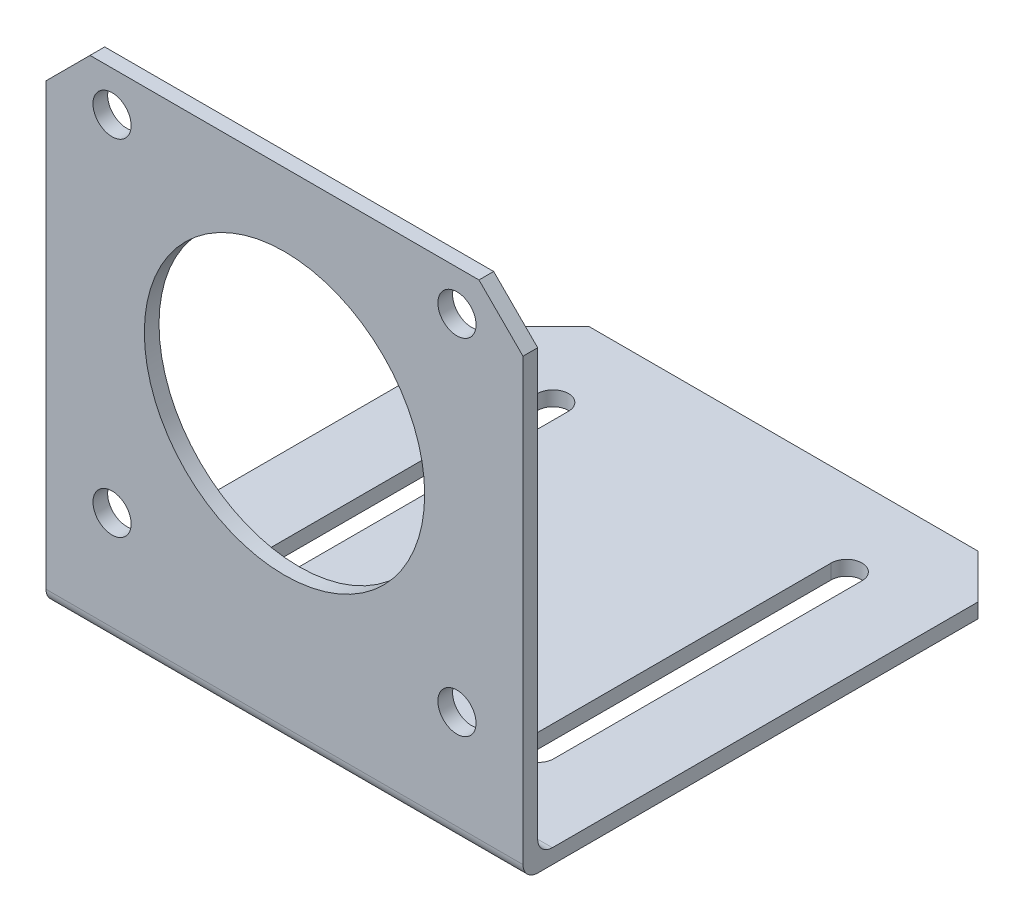
ISO-10303-21;
HEADER;
FILE_DESCRIPTION(('STEP AP214'),'2;1');
FILE_NAME('part.step','',(''),(''),'','','');
FILE_SCHEMA(('AUTOMOTIVE_DESIGN { 1 0 10303 214 1 1 1 1 }'));
ENDSEC;
DATA;
#1=APPLICATION_CONTEXT('core data for automotive mechanical design processes');
#2=APPLICATION_PROTOCOL_DEFINITION('international standard','automotive_design',2000,#1);
#3=PRODUCT_CONTEXT('',#1,'mechanical');
#4=PRODUCT('Part','Part','',(#3));
#5=PRODUCT_RELATED_PRODUCT_CATEGORY('part','',(#4));
#6=PRODUCT_DEFINITION_FORMATION('','',#4);
#7=PRODUCT_DEFINITION_CONTEXT('part definition',#1,'design');
#8=PRODUCT_DEFINITION('design','',#6,#7);
#9=PRODUCT_DEFINITION_SHAPE('','',#8);
#10=(LENGTH_UNIT() NAMED_UNIT(*) SI_UNIT(.MILLI.,.METRE.));
#11=(NAMED_UNIT(*) PLANE_ANGLE_UNIT() SI_UNIT($,.RADIAN.));
#12=(NAMED_UNIT(*) SI_UNIT($,.STERADIAN.) SOLID_ANGLE_UNIT());
#13=UNCERTAINTY_MEASURE_WITH_UNIT(LENGTH_MEASURE(1.E-05),#10,'distance_accuracy_value','');
#14=(GEOMETRIC_REPRESENTATION_CONTEXT(3) GLOBAL_UNCERTAINTY_ASSIGNED_CONTEXT((#13)) GLOBAL_UNIT_ASSIGNED_CONTEXT((#10,
#11,#12)) REPRESENTATION_CONTEXT('',''));
#15=CARTESIAN_POINT('',(0.,0.,0.));
#16=DIRECTION('',(0.,0.,1.));
#17=DIRECTION('',(1.,0.,0.));
#18=AXIS2_PLACEMENT_3D('',#15,#16,#17);
#19=CARTESIAN_POINT('',(-28.953125,-17.4203125,2.));
#20=DIRECTION('',(0.,1.,0.));
#21=DIRECTION('',(0.,0.,1.));
#22=AXIS2_PLACEMENT_3D('',#19,#20,#21);
#23=PLANE('',#22);
#24=DIRECTION('',(0.,0.,-1.));
#25=VECTOR('',#24,1.);
#26=CARTESIAN_POINT('',(36.046875,-17.4203125,2.));
#27=LINE('',#26,#25);
#28=CARTESIAN_POINT('',(36.046875,-17.4203125,0.));
#29=VERTEX_POINT('',#28);
#30=CARTESIAN_POINT('',(36.046875,-17.4203125,-60.));
#31=VERTEX_POINT('',#30);
#32=EDGE_CURVE('E262',#29,#31,#27,.T.);
#33=ORIENTED_EDGE('',*,*,#32,.F.);
#34=DIRECTION('',(1.,0.,0.));
#35=VECTOR('',#34,1.);
#36=CARTESIAN_POINT('',(-28.953125,-17.4203125,0.));
#37=LINE('',#36,#35);
#38=CARTESIAN_POINT('',(-28.953125,-17.4203125,0.));
#39=VERTEX_POINT('',#38);
#40=EDGE_CURVE('E319',#29,#39,#37,.F.);
#41=ORIENTED_EDGE('',*,*,#40,.T.);
#42=DIRECTION('',(0.,0.,-1.));
#43=VECTOR('',#42,1.);
#44=CARTESIAN_POINT('',(-28.953125,-17.4203125,2.));
#45=LINE('',#44,#43);
#46=CARTESIAN_POINT('',(-28.953125,-17.4203125,-60.));
#47=VERTEX_POINT('',#46);
#48=EDGE_CURVE('E268',#39,#47,#45,.T.);
#49=ORIENTED_EDGE('',*,*,#48,.T.);
#50=DIRECTION('',(0.707106781186547,0.,-0.707106781186548));
#51=VECTOR('',#50,1.);
#52=CARTESIAN_POINT('',(-22.953125,-17.4203125,-66.));
#53=LINE('',#52,#51);
#54=CARTESIAN_POINT('',(-22.953125,-17.4203125,-66.));
#55=VERTEX_POINT('',#54);
#56=EDGE_CURVE('E290',#47,#55,#53,.T.);
#57=ORIENTED_EDGE('',*,*,#56,.T.);
#58=DIRECTION('',(1.,0.,0.));
#59=VECTOR('',#58,1.);
#60=CARTESIAN_POINT('',(-28.953125,-17.4203125,-66.));
#61=LINE('',#60,#59);
#62=CARTESIAN_POINT('',(30.046875,-17.4203125,-66.));
#63=VERTEX_POINT('',#62);
#64=EDGE_CURVE('E244',#55,#63,#61,.T.);
#65=ORIENTED_EDGE('',*,*,#64,.T.);
#66=DIRECTION('',(0.70710678118655,0.,0.707106781186545));
#67=VECTOR('',#66,1.);
#68=CARTESIAN_POINT('',(36.046875,-17.4203125,-60.));
#69=LINE('',#68,#67);
#70=EDGE_CURVE('E279',#63,#31,#69,.T.);
#71=ORIENTED_EDGE('',*,*,#70,.T.);
#72=EDGE_LOOP('',(#33,#41,#49,#57,#65,#71));
#73=FACE_BOUND('',#72,.T.);
#74=DIRECTION('',(0.,0.,-1.));
#75=VECTOR('',#74,1.);
#76=CARTESIAN_POINT('',(21.446875,-17.4203125,-12.5946516396418));
#77=LINE('',#76,#75);
#78=CARTESIAN_POINT('',(21.446875,-17.4203125,-12.5946516396418));
#79=VERTEX_POINT('',#78);
#80=CARTESIAN_POINT('',(21.446875,-17.4203125,-54.5946516396418));
#81=VERTEX_POINT('',#80);
#82=EDGE_CURVE('E218',#79,#81,#77,.T.);
#83=ORIENTED_EDGE('',*,*,#82,.F.);
#84=CARTESIAN_POINT('',(23.546875,-17.4203125,-12.5946516396418));
#85=DIRECTION('',(0.,1.,0.));
#86=DIRECTION('',(-1.,0.,0.));
#87=AXIS2_PLACEMENT_3D('',#84,#85,#86);
#88=CIRCLE('',#87,2.1);
#89=CARTESIAN_POINT('',(25.646875,-17.4203125,-12.5946516396418));
#90=VERTEX_POINT('',#89);
#91=EDGE_CURVE('E208',#79,#90,#88,.T.);
#92=ORIENTED_EDGE('',*,*,#91,.T.);
#93=DIRECTION('',(0.,0.,-1.));
#94=VECTOR('',#93,1.);
#95=CARTESIAN_POINT('',(25.646875,-17.4203125,-12.5946516396418));
#96=LINE('',#95,#94);
#97=CARTESIAN_POINT('',(25.646875,-17.4203125,-54.5946516396418));
#98=VERTEX_POINT('',#97);
#99=EDGE_CURVE('E211',#90,#98,#96,.T.);
#100=ORIENTED_EDGE('',*,*,#99,.T.);
#101=CARTESIAN_POINT('',(23.546875,-17.4203125,-54.5946516396418));
#102=DIRECTION('',(0.,1.,0.));
#103=DIRECTION('',(-1.,0.,0.));
#104=AXIS2_PLACEMENT_3D('',#101,#102,#103);
#105=CIRCLE('',#104,2.09999999999999);
#106=EDGE_CURVE('E215',#98,#81,#105,.T.);
#107=ORIENTED_EDGE('',*,*,#106,.T.);
#108=EDGE_LOOP('',(#83,#92,#100,#107));
#109=FACE_BOUND('',#108,.T.);
#110=CARTESIAN_POINT('',(-16.453125,-17.4203125,-12.5946516396418));
#111=DIRECTION('',(0.,-1.,0.));
#112=DIRECTION('',(1.,0.,0.));
#113=AXIS2_PLACEMENT_3D('',#110,#111,#112);
#114=CIRCLE('',#113,2.1);
#115=CARTESIAN_POINT('',(-14.353125,-17.4203125,-12.5946516396418));
#116=VERTEX_POINT('',#115);
#117=CARTESIAN_POINT('',(-18.553125,-17.4203125,-12.5946516396418));
#118=VERTEX_POINT('',#117);
#119=EDGE_CURVE('E191',#116,#118,#114,.T.);
#120=ORIENTED_EDGE('',*,*,#119,.F.);
#121=DIRECTION('',(0.,0.,-1.));
#122=VECTOR('',#121,1.);
#123=CARTESIAN_POINT('',(-14.353125,-17.4203125,-12.5946516396418));
#124=LINE('',#123,#122);
#125=CARTESIAN_POINT('',(-14.353125,-17.4203125,-54.5946516396418));
#126=VERTEX_POINT('',#125);
#127=EDGE_CURVE('E202',#116,#126,#124,.T.);
#128=ORIENTED_EDGE('',*,*,#127,.T.);
#129=CARTESIAN_POINT('',(-16.453125,-17.4203125,-54.5946516396418));
#130=DIRECTION('',(0.,-1.,0.));
#131=DIRECTION('',(1.,0.,0.));
#132=AXIS2_PLACEMENT_3D('',#129,#130,#131);
#133=CIRCLE('',#132,2.09999999999999);
#134=CARTESIAN_POINT('',(-18.553125,-17.4203125,-54.5946516396418));
#135=VERTEX_POINT('',#134);
#136=EDGE_CURVE('E178',#135,#126,#133,.T.);
#137=ORIENTED_EDGE('',*,*,#136,.F.);
#138=DIRECTION('',(0.,0.,-1.));
#139=VECTOR('',#138,1.);
#140=CARTESIAN_POINT('',(-18.553125,-17.4203125,-12.5946516396418));
#141=LINE('',#140,#139);
#142=EDGE_CURVE('E205',#118,#135,#141,.T.);
#143=ORIENTED_EDGE('',*,*,#142,.F.);
#144=EDGE_LOOP('',(#120,#128,#137,#143));
#145=FACE_BOUND('',#144,.T.);
#146=ADVANCED_FACE('F34',(#73,#109,#145),#23,.F.);
#147=CARTESIAN_POINT('',(-28.953125,-15.4203125,0.));
#148=DIRECTION('',(0.,1.,0.));
#149=DIRECTION('',(-1.,0.,0.));
#150=AXIS2_PLACEMENT_3D('',#147,#148,#149);
#151=PLANE('',#150);
#152=CARTESIAN_POINT('',(23.546875,-15.4203125,-12.5946516396418));
#153=DIRECTION('',(0.,1.,0.));
#154=DIRECTION('',(-1.,0.,0.));
#155=AXIS2_PLACEMENT_3D('',#152,#153,#154);
#156=CIRCLE('',#155,2.1);
#157=CARTESIAN_POINT('',(21.446875,-15.4203125,-12.5946516396418));
#158=VERTEX_POINT('',#157);
#159=CARTESIAN_POINT('',(25.646875,-15.4203125,-12.5946516396418));
#160=VERTEX_POINT('',#159);
#161=EDGE_CURVE('E201',#158,#160,#156,.T.);
#162=ORIENTED_EDGE('',*,*,#161,.F.);
#163=DIRECTION('',(0.,0.,-1.));
#164=VECTOR('',#163,1.);
#165=CARTESIAN_POINT('',(21.446875,-15.4203125,-12.5946516396418));
#166=LINE('',#165,#164);
#167=CARTESIAN_POINT('',(21.446875,-15.4203125,-54.5946516396418));
#168=VERTEX_POINT('',#167);
#169=EDGE_CURVE('E212',#158,#168,#166,.T.);
#170=ORIENTED_EDGE('',*,*,#169,.T.);
#171=CARTESIAN_POINT('',(23.546875,-15.4203125,-54.5946516396418));
#172=DIRECTION('',(0.,1.,0.));
#173=DIRECTION('',(-1.,0.,0.));
#174=AXIS2_PLACEMENT_3D('',#171,#172,#173);
#175=CIRCLE('',#174,2.09999999999999);
#176=CARTESIAN_POINT('',(25.646875,-15.4203125,-54.5946516396418));
#177=VERTEX_POINT('',#176);
#178=EDGE_CURVE('E225',#177,#168,#175,.T.);
#179=ORIENTED_EDGE('',*,*,#178,.F.);
#180=DIRECTION('',(0.,0.,-1.));
#181=VECTOR('',#180,1.);
#182=CARTESIAN_POINT('',(25.646875,-15.4203125,-12.5946516396418));
#183=LINE('',#182,#181);
#184=EDGE_CURVE('E222',#160,#177,#183,.T.);
#185=ORIENTED_EDGE('',*,*,#184,.F.);
#186=EDGE_LOOP('',(#162,#170,#179,#185));
#187=FACE_BOUND('',#186,.T.);
#188=DIRECTION('',(0.,0.,1.));
#189=VECTOR('',#188,1.);
#190=CARTESIAN_POINT('',(-28.953125,-15.4203125,0.));
#191=LINE('',#190,#189);
#192=CARTESIAN_POINT('',(-28.953125,-15.4203125,-60.));
#193=VERTEX_POINT('',#192);
#194=CARTESIAN_POINT('',(-28.953125,-15.4203125,-2.));
#195=VERTEX_POINT('',#194);
#196=EDGE_CURVE('E239',#193,#195,#191,.T.);
#197=ORIENTED_EDGE('',*,*,#196,.T.);
#198=DIRECTION('',(1.,0.,0.));
#199=VECTOR('',#198,1.);
#200=CARTESIAN_POINT('',(-28.953125,-15.4203125,-2.));
#201=LINE('',#200,#199);
#202=CARTESIAN_POINT('',(36.046875,-15.4203125,-2.));
#203=VERTEX_POINT('',#202);
#204=EDGE_CURVE('E323',#195,#203,#201,.T.);
#205=ORIENTED_EDGE('',*,*,#204,.T.);
#206=DIRECTION('',(0.,0.,1.));
#207=VECTOR('',#206,1.);
#208=CARTESIAN_POINT('',(36.046875,-15.4203125,0.));
#209=LINE('',#208,#207);
#210=CARTESIAN_POINT('',(36.046875,-15.4203125,-60.));
#211=VERTEX_POINT('',#210);
#212=EDGE_CURVE('E232',#211,#203,#209,.T.);
#213=ORIENTED_EDGE('',*,*,#212,.F.);
#214=DIRECTION('',(-0.70710678118655,0.,-0.707106781186545));
#215=VECTOR('',#214,1.);
#216=CARTESIAN_POINT('',(33.5468749999998,-15.4203125,-62.5000000000002));
#217=LINE('',#216,#215);
#218=CARTESIAN_POINT('',(30.046875,-15.4203125,-66.));
#219=VERTEX_POINT('',#218);
#220=EDGE_CURVE('E273',#211,#219,#217,.T.);
#221=ORIENTED_EDGE('',*,*,#220,.T.);
#222=DIRECTION('',(1.,0.,0.));
#223=VECTOR('',#222,1.);
#224=CARTESIAN_POINT('',(-28.953125,-15.4203125,-66.));
#225=LINE('',#224,#223);
#226=CARTESIAN_POINT('',(-22.953125,-15.4203125,-66.));
#227=VERTEX_POINT('',#226);
#228=EDGE_CURVE('E242',#227,#219,#225,.T.);
#229=ORIENTED_EDGE('',*,*,#228,.F.);
#230=DIRECTION('',(-0.707106781186547,0.,0.707106781186548));
#231=VECTOR('',#230,1.);
#232=CARTESIAN_POINT('',(-58.953125,-15.4203125,-30.));
#233=LINE('',#232,#231);
#234=EDGE_CURVE('E285',#227,#193,#233,.T.);
#235=ORIENTED_EDGE('',*,*,#234,.T.);
#236=EDGE_LOOP('',(#197,#205,#213,#221,#229,#235));
#237=FACE_BOUND('',#236,.T.);
#238=DIRECTION('',(0.,0.,-1.));
#239=VECTOR('',#238,1.);
#240=CARTESIAN_POINT('',(-14.353125,-15.4203125,-12.5946516396418));
#241=LINE('',#240,#239);
#242=CARTESIAN_POINT('',(-14.353125,-15.4203125,-12.5946516396418));
#243=VERTEX_POINT('',#242);
#244=CARTESIAN_POINT('',(-14.353125,-15.4203125,-54.5946516396418));
#245=VERTEX_POINT('',#244);
#246=EDGE_CURVE('E187',#243,#245,#241,.T.);
#247=ORIENTED_EDGE('',*,*,#246,.F.);
#248=CARTESIAN_POINT('',(-16.453125,-15.4203125,-12.5946516396418));
#249=DIRECTION('',(0.,-1.,0.));
#250=DIRECTION('',(1.,0.,0.));
#251=AXIS2_PLACEMENT_3D('',#248,#249,#250);
#252=CIRCLE('',#251,2.1);
#253=CARTESIAN_POINT('',(-18.553125,-15.4203125,-12.5946516396418));
#254=VERTEX_POINT('',#253);
#255=EDGE_CURVE('E196',#243,#254,#252,.T.);
#256=ORIENTED_EDGE('',*,*,#255,.T.);
#257=DIRECTION('',(0.,0.,-1.));
#258=VECTOR('',#257,1.);
#259=CARTESIAN_POINT('',(-18.553125,-15.4203125,-12.5946516396418));
#260=LINE('',#259,#258);
#261=CARTESIAN_POINT('',(-18.553125,-15.4203125,-54.5946516396418));
#262=VERTEX_POINT('',#261);
#263=EDGE_CURVE('E194',#254,#262,#260,.T.);
#264=ORIENTED_EDGE('',*,*,#263,.T.);
#265=CARTESIAN_POINT('',(-16.453125,-15.4203125,-54.5946516396418));
#266=DIRECTION('',(0.,-1.,0.));
#267=DIRECTION('',(1.,0.,0.));
#268=AXIS2_PLACEMENT_3D('',#265,#266,#267);
#269=CIRCLE('',#268,2.09999999999999);
#270=EDGE_CURVE('E175',#262,#245,#269,.T.);
#271=ORIENTED_EDGE('',*,*,#270,.T.);
#272=EDGE_LOOP('',(#247,#256,#264,#271));
#273=FACE_BOUND('',#272,.T.);
#274=ADVANCED_FACE('F193',(#187,#237,#273),#151,.T.);
#275=CARTESIAN_POINT('',(0.,0.,0.));
#276=DIRECTION('',(0.,0.,1.));
#277=DIRECTION('',(1.,0.,0.));
#278=AXIS2_PLACEMENT_3D('',#275,#276,#277);
#279=PLANE('',#278);
#280=CARTESIAN_POINT('',(-19.953125,45.0796875,0.));
#281=DIRECTION('',(0.,0.,-1.));
#282=DIRECTION('',(1.,0.,0.));
#283=AXIS2_PLACEMENT_3D('',#280,#281,#282);
#284=CIRCLE('',#283,2.6);
#285=CARTESIAN_POINT('',(-17.353125,45.0796875,0.));
#286=VERTEX_POINT('',#285);
#287=EDGE_CURVE('E599',#286,#286,#284,.T.);
#288=ORIENTED_EDGE('',*,*,#287,.F.);
#289=EDGE_LOOP('',(#288));
#290=FACE_BOUND('',#289,.T.);
#291=CARTESIAN_POINT('',(-19.953125,-1.92031249999998,0.));
#292=DIRECTION('',(0.,0.,-1.));
#293=DIRECTION('',(-1.,0.,0.));
#294=AXIS2_PLACEMENT_3D('',#291,#292,#293);
#295=CIRCLE('',#294,2.6);
#296=CARTESIAN_POINT('',(-22.553125,-1.92031249999998,0.));
#297=VERTEX_POINT('',#296);
#298=EDGE_CURVE('E605',#297,#297,#295,.T.);
#299=ORIENTED_EDGE('',*,*,#298,.F.);
#300=EDGE_LOOP('',(#299));
#301=FACE_BOUND('',#300,.T.);
#302=CARTESIAN_POINT('',(27.046875,-1.92031249999999,0.));
#303=DIRECTION('',(0.,0.,-1.));
#304=DIRECTION('',(1.,0.,0.));
#305=AXIS2_PLACEMENT_3D('',#302,#303,#304);
#306=CIRCLE('',#305,2.6);
#307=CARTESIAN_POINT('',(29.646875,-1.92031249999999,0.));
#308=VERTEX_POINT('',#307);
#309=EDGE_CURVE('E613',#308,#308,#306,.T.);
#310=ORIENTED_EDGE('',*,*,#309,.F.);
#311=EDGE_LOOP('',(#310));
#312=FACE_BOUND('',#311,.T.);
#313=CARTESIAN_POINT('',(27.046875,45.0796875,0.));
#314=DIRECTION('',(0.,0.,-1.));
#315=DIRECTION('',(-1.,0.,0.));
#316=AXIS2_PLACEMENT_3D('',#313,#314,#315);
#317=CIRCLE('',#316,2.6);
#318=CARTESIAN_POINT('',(24.446875,45.0796875,0.));
#319=VERTEX_POINT('',#318);
#320=EDGE_CURVE('E602',#319,#319,#317,.T.);
#321=ORIENTED_EDGE('',*,*,#320,.F.);
#322=EDGE_LOOP('',(#321));
#323=FACE_BOUND('',#322,.T.);
#324=CARTESIAN_POINT('',(3.54687500000002,21.5796875,0.));
#325=DIRECTION('',(0.,0.,1.));
#326=DIRECTION('',(1.,0.,0.));
#327=AXIS2_PLACEMENT_3D('',#324,#325,#326);
#328=CIRCLE('',#327,19.1);
#329=CARTESIAN_POINT('',(22.646875,21.5796875,0.));
#330=VERTEX_POINT('',#329);
#331=EDGE_CURVE('E246',#330,#330,#328,.T.);
#332=ORIENTED_EDGE('',*,*,#331,.T.);
#333=EDGE_LOOP('',(#332));
#334=FACE_BOUND('',#333,.T.);
#335=DIRECTION('',(0.,1.,0.));
#336=VECTOR('',#335,1.);
#337=CARTESIAN_POINT('',(36.046875,50.5796875,0.));
#338=LINE('',#337,#336);
#339=CARTESIAN_POINT('',(36.046875,-13.4203125,0.));
#340=VERTEX_POINT('',#339);
#341=CARTESIAN_POINT('',(36.046875,44.5796875,0.));
#342=VERTEX_POINT('',#341);
#343=EDGE_CURVE('E264',#340,#342,#338,.T.);
#344=ORIENTED_EDGE('',*,*,#343,.F.);
#345=DIRECTION('',(1.,0.,0.));
#346=VECTOR('',#345,1.);
#347=CARTESIAN_POINT('',(0.,-13.4203125,0.));
#348=LINE('',#347,#346);
#349=CARTESIAN_POINT('',(-28.953125,-13.4203125,0.));
#350=VERTEX_POINT('',#349);
#351=EDGE_CURVE('E49',#340,#350,#348,.F.);
#352=ORIENTED_EDGE('',*,*,#351,.T.);
#353=DIRECTION('',(0.,-1.,0.));
#354=VECTOR('',#353,1.);
#355=CARTESIAN_POINT('',(-28.953125,50.5796875,0.));
#356=LINE('',#355,#354);
#357=CARTESIAN_POINT('',(-28.953125,44.5796875,0.));
#358=VERTEX_POINT('',#357);
#359=EDGE_CURVE('E251',#358,#350,#356,.T.);
#360=ORIENTED_EDGE('',*,*,#359,.F.);
#361=DIRECTION('',(-0.707106781186548,-0.707106781186547,0.));
#362=VECTOR('',#361,1.);
#363=CARTESIAN_POINT('',(-28.953125,44.5796875,0.));
#364=LINE('',#363,#362);
#365=CARTESIAN_POINT('',(-22.953125,50.5796875,0.));
#366=VERTEX_POINT('',#365);
#367=EDGE_CURVE('E295',#358,#366,#364,.F.);
#368=ORIENTED_EDGE('',*,*,#367,.T.);
#369=DIRECTION('',(-1.,0.,0.));
#370=VECTOR('',#369,1.);
#371=CARTESIAN_POINT('',(-28.953125,50.5796875,0.));
#372=LINE('',#371,#370);
#373=CARTESIAN_POINT('',(30.046875,50.5796875,0.));
#374=VERTEX_POINT('',#373);
#375=EDGE_CURVE('E258',#374,#366,#372,.T.);
#376=ORIENTED_EDGE('',*,*,#375,.F.);
#377=DIRECTION('',(-0.707106781186546,0.707106781186549,0.));
#378=VECTOR('',#377,1.);
#379=CARTESIAN_POINT('',(30.046875,50.5796875,0.));
#380=LINE('',#379,#378);
#381=EDGE_CURVE('E306',#374,#342,#380,.F.);
#382=ORIENTED_EDGE('',*,*,#381,.T.);
#383=EDGE_LOOP('',(#344,#352,#360,#368,#376,#382));
#384=FACE_BOUND('',#383,.T.);
#385=ADVANCED_FACE('F371',(#290,#301,#312,#323,#334,#384),#279,.F.);
#386=CARTESIAN_POINT('',(0.,0.,2.));
#387=DIRECTION('',(0.,0.,1.));
#388=DIRECTION('',(1.,0.,0.));
#389=AXIS2_PLACEMENT_3D('',#386,#387,#388);
#390=PLANE('',#389);
#391=CARTESIAN_POINT('',(-19.953125,45.0796875,2.));
#392=DIRECTION('',(0.,0.,-1.));
#393=DIRECTION('',(1.,0.,0.));
#394=AXIS2_PLACEMENT_3D('',#391,#392,#393);
#395=CIRCLE('',#394,2.6);
#396=CARTESIAN_POINT('',(-17.353125,45.0796875,2.));
#397=VERTEX_POINT('',#396);
#398=EDGE_CURVE('E597',#397,#397,#395,.T.);
#399=ORIENTED_EDGE('',*,*,#398,.T.);
#400=EDGE_LOOP('',(#399));
#401=FACE_BOUND('',#400,.T.);
#402=CARTESIAN_POINT('',(-19.953125,-1.92031249999998,2.));
#403=DIRECTION('',(0.,0.,-1.));
#404=DIRECTION('',(-1.,0.,0.));
#405=AXIS2_PLACEMENT_3D('',#402,#403,#404);
#406=CIRCLE('',#405,2.6);
#407=CARTESIAN_POINT('',(-22.553125,-1.92031249999998,2.));
#408=VERTEX_POINT('',#407);
#409=EDGE_CURVE('E600',#408,#408,#406,.T.);
#410=ORIENTED_EDGE('',*,*,#409,.T.);
#411=EDGE_LOOP('',(#410));
#412=FACE_BOUND('',#411,.T.);
#413=CARTESIAN_POINT('',(27.046875,-1.92031249999999,2.));
#414=DIRECTION('',(0.,0.,-1.));
#415=DIRECTION('',(1.,0.,0.));
#416=AXIS2_PLACEMENT_3D('',#413,#414,#415);
#417=CIRCLE('',#416,2.6);
#418=CARTESIAN_POINT('',(29.646875,-1.92031249999999,2.));
#419=VERTEX_POINT('',#418);
#420=EDGE_CURVE('E610',#419,#419,#417,.T.);
#421=ORIENTED_EDGE('',*,*,#420,.T.);
#422=EDGE_LOOP('',(#421));
#423=FACE_BOUND('',#422,.T.);
#424=CARTESIAN_POINT('',(27.046875,45.0796875,2.));
#425=DIRECTION('',(0.,0.,-1.));
#426=DIRECTION('',(-1.,0.,0.));
#427=AXIS2_PLACEMENT_3D('',#424,#425,#426);
#428=CIRCLE('',#427,2.6);
#429=CARTESIAN_POINT('',(24.446875,45.0796875,2.));
#430=VERTEX_POINT('',#429);
#431=EDGE_CURVE('E616',#430,#430,#428,.T.);
#432=ORIENTED_EDGE('',*,*,#431,.T.);
#433=EDGE_LOOP('',(#432));
#434=FACE_BOUND('',#433,.T.);
#435=DIRECTION('',(0.,-1.,0.));
#436=VECTOR('',#435,1.);
#437=CARTESIAN_POINT('',(-28.953125,50.5796875,2.));
#438=LINE('',#437,#436);
#439=CARTESIAN_POINT('',(-28.953125,44.5796875,2.));
#440=VERTEX_POINT('',#439);
#441=CARTESIAN_POINT('',(-28.953125,-15.4203125,2.));
#442=VERTEX_POINT('',#441);
#443=EDGE_CURVE('E254',#440,#442,#438,.T.);
#444=ORIENTED_EDGE('',*,*,#443,.T.);
#445=DIRECTION('',(1.,0.,0.));
#446=VECTOR('',#445,1.);
#447=CARTESIAN_POINT('',(36.046875,-15.4203125,2.));
#448=LINE('',#447,#446);
#449=CARTESIAN_POINT('',(36.046875,-15.4203125,2.));
#450=VERTEX_POINT('',#449);
#451=EDGE_CURVE('E314',#442,#450,#448,.T.);
#452=ORIENTED_EDGE('',*,*,#451,.T.);
#453=DIRECTION('',(0.,1.,0.));
#454=VECTOR('',#453,1.);
#455=CARTESIAN_POINT('',(36.046875,50.5796875,2.));
#456=LINE('',#455,#454);
#457=CARTESIAN_POINT('',(36.046875,44.5796875,2.));
#458=VERTEX_POINT('',#457);
#459=EDGE_CURVE('E257',#450,#458,#456,.T.);
#460=ORIENTED_EDGE('',*,*,#459,.T.);
#461=DIRECTION('',(0.707106781186546,-0.707106781186549,0.));
#462=VECTOR('',#461,1.);
#463=CARTESIAN_POINT('',(40.3132812500001,40.3132812499999,2.));
#464=LINE('',#463,#462);
#465=CARTESIAN_POINT('',(30.046875,50.5796875,2.));
#466=VERTEX_POINT('',#465);
#467=EDGE_CURVE('E312',#458,#466,#464,.F.);
#468=ORIENTED_EDGE('',*,*,#467,.T.);
#469=DIRECTION('',(-1.,0.,0.));
#470=VECTOR('',#469,1.);
#471=CARTESIAN_POINT('',(-28.953125,50.5796875,2.));
#472=LINE('',#471,#470);
#473=CARTESIAN_POINT('',(-22.953125,50.5796875,2.));
#474=VERTEX_POINT('',#473);
#475=EDGE_CURVE('E260',#466,#474,#472,.T.);
#476=ORIENTED_EDGE('',*,*,#475,.T.);
#477=DIRECTION('',(0.707106781186548,0.707106781186547,0.));
#478=VECTOR('',#477,1.);
#479=CARTESIAN_POINT('',(-36.76640625,36.7664062500001,2.));
#480=LINE('',#479,#478);
#481=EDGE_CURVE('E301',#474,#440,#480,.F.);
#482=ORIENTED_EDGE('',*,*,#481,.T.);
#483=EDGE_LOOP('',(#444,#452,#460,#468,#476,#482));
#484=FACE_BOUND('',#483,.T.);
#485=CARTESIAN_POINT('',(3.54687500000002,21.5796875,2.));
#486=DIRECTION('',(0.,0.,1.));
#487=DIRECTION('',(1.,0.,0.));
#488=AXIS2_PLACEMENT_3D('',#485,#486,#487);
#489=CIRCLE('',#488,19.1);
#490=CARTESIAN_POINT('',(22.646875,21.5796875,2.));
#491=VERTEX_POINT('',#490);
#492=EDGE_CURVE('E248',#491,#491,#489,.T.);
#493=ORIENTED_EDGE('',*,*,#492,.F.);
#494=EDGE_LOOP('',(#493));
#495=FACE_BOUND('',#494,.T.);
#496=ADVANCED_FACE('F380',(#401,#412,#423,#434,#484,#495),#390,.T.);
#497=CARTESIAN_POINT('',(-28.953125,50.5796875,2.));
#498=DIRECTION('',(1.,0.,0.));
#499=DIRECTION('',(0.,1.,0.));
#500=AXIS2_PLACEMENT_3D('',#497,#498,#499);
#501=PLANE('',#500);
#502=ORIENTED_EDGE('',*,*,#48,.F.);
#503=CARTESIAN_POINT('',(-28.953125,-15.4203125,0.));
#504=DIRECTION('',(1.,0.,0.));
#505=DIRECTION('',(0.,1.,0.));
#506=AXIS2_PLACEMENT_3D('',#503,#504,#505);
#507=CIRCLE('',#506,2.);
#508=EDGE_CURVE('E321',#39,#442,#507,.F.);
#509=ORIENTED_EDGE('',*,*,#508,.T.);
#510=ORIENTED_EDGE('',*,*,#443,.F.);
#511=DIRECTION('',(0.,0.,-1.));
#512=VECTOR('',#511,1.);
#513=CARTESIAN_POINT('',(-28.953125,44.5796875,2.));
#514=LINE('',#513,#512);
#515=EDGE_CURVE('E292',#440,#358,#514,.T.);
#516=ORIENTED_EDGE('',*,*,#515,.T.);
#517=ORIENTED_EDGE('',*,*,#359,.T.);
#518=CARTESIAN_POINT('',(-28.953125,-13.4203125,-2.));
#519=DIRECTION('',(1.,0.,0.));
#520=DIRECTION('',(0.,1.,0.));
#521=AXIS2_PLACEMENT_3D('',#518,#519,#520);
#522=CIRCLE('',#521,2.);
#523=EDGE_CURVE('E11',#350,#195,#522,.T.);
#524=ORIENTED_EDGE('',*,*,#523,.T.);
#525=ORIENTED_EDGE('',*,*,#196,.F.);
#526=DIRECTION('',(0.,-1.,0.));
#527=VECTOR('',#526,1.);
#528=CARTESIAN_POINT('',(-28.953125,-17.4203125,-60.));
#529=LINE('',#528,#527);
#530=EDGE_CURVE('E287',#193,#47,#529,.T.);
#531=ORIENTED_EDGE('',*,*,#530,.T.);
#532=EDGE_LOOP('',(#502,#509,#510,#516,#517,#524,#525,#531));
#533=FACE_BOUND('',#532,.T.);
#534=ADVANCED_FACE('F351',(#533),#501,.F.);
#535=CARTESIAN_POINT('',(36.046875,50.5796875,2.));
#536=DIRECTION('',(-1.,0.,0.));
#537=DIRECTION('',(0.,-1.,0.));
#538=AXIS2_PLACEMENT_3D('',#535,#536,#537);
#539=PLANE('',#538);
#540=ORIENTED_EDGE('',*,*,#459,.F.);
#541=CARTESIAN_POINT('',(36.046875,-15.4203125,0.));
#542=DIRECTION('',(-1.,0.,0.));
#543=DIRECTION('',(0.,-1.,0.));
#544=AXIS2_PLACEMENT_3D('',#541,#542,#543);
#545=CIRCLE('',#544,2.);
#546=EDGE_CURVE('E317',#450,#29,#545,.F.);
#547=ORIENTED_EDGE('',*,*,#546,.T.);
#548=ORIENTED_EDGE('',*,*,#32,.T.);
#549=DIRECTION('',(0.,1.,0.));
#550=VECTOR('',#549,1.);
#551=CARTESIAN_POINT('',(36.046875,-15.4203125,-60.));
#552=LINE('',#551,#550);
#553=EDGE_CURVE('E270',#31,#211,#552,.T.);
#554=ORIENTED_EDGE('',*,*,#553,.T.);
#555=ORIENTED_EDGE('',*,*,#212,.T.);
#556=CARTESIAN_POINT('',(36.046875,-13.4203125,-2.));
#557=DIRECTION('',(-1.,0.,0.));
#558=DIRECTION('',(0.,-1.,0.));
#559=AXIS2_PLACEMENT_3D('',#556,#557,#558);
#560=CIRCLE('',#559,2.);
#561=EDGE_CURVE('E42',#203,#340,#560,.T.);
#562=ORIENTED_EDGE('',*,*,#561,.T.);
#563=ORIENTED_EDGE('',*,*,#343,.T.);
#564=DIRECTION('',(0.,0.,1.));
#565=VECTOR('',#564,1.);
#566=CARTESIAN_POINT('',(36.046875,44.5796875,2.));
#567=LINE('',#566,#565);
#568=EDGE_CURVE('E309',#342,#458,#567,.T.);
#569=ORIENTED_EDGE('',*,*,#568,.T.);
#570=EDGE_LOOP('',(#540,#547,#548,#554,#555,#562,#563,#569));
#571=FACE_BOUND('',#570,.T.);
#572=ADVANCED_FACE('F333',(#571),#539,.F.);
#573=CARTESIAN_POINT('',(-28.953125,50.5796875,2.));
#574=DIRECTION('',(0.,-1.,0.));
#575=DIRECTION('',(0.,0.,-1.));
#576=AXIS2_PLACEMENT_3D('',#573,#574,#575);
#577=PLANE('',#576);
#578=ORIENTED_EDGE('',*,*,#475,.F.);
#579=DIRECTION('',(0.,0.,-1.));
#580=VECTOR('',#579,1.);
#581=CARTESIAN_POINT('',(30.046875,50.5796875,2.));
#582=LINE('',#581,#580);
#583=EDGE_CURVE('E303',#466,#374,#582,.T.);
#584=ORIENTED_EDGE('',*,*,#583,.T.);
#585=ORIENTED_EDGE('',*,*,#375,.T.);
#586=DIRECTION('',(0.,0.,1.));
#587=VECTOR('',#586,1.);
#588=CARTESIAN_POINT('',(-22.953125,50.5796875,2.));
#589=LINE('',#588,#587);
#590=EDGE_CURVE('E298',#366,#474,#589,.T.);
#591=ORIENTED_EDGE('',*,*,#590,.T.);
#592=EDGE_LOOP('',(#578,#584,#585,#591));
#593=FACE_BOUND('',#592,.T.);
#594=ADVANCED_FACE('F400',(#593),#577,.F.);
#595=CARTESIAN_POINT('',(3.54687500000002,21.5796875,2.));
#596=DIRECTION('',(0.,0.,-1.));
#597=DIRECTION('',(-1.,0.,0.));
#598=AXIS2_PLACEMENT_3D('',#595,#596,#597);
#599=CYLINDRICAL_SURFACE('',#598,19.1);
#600=ORIENTED_EDGE('',*,*,#492,.T.);
#601=EDGE_LOOP('',(#600));
#602=FACE_BOUND('',#601,.T.);
#603=ORIENTED_EDGE('',*,*,#331,.F.);
#604=EDGE_LOOP('',(#603));
#605=FACE_BOUND('',#604,.T.);
#606=ADVANCED_FACE('F420',(#602,#605),#599,.F.);
#607=CARTESIAN_POINT('',(-28.953125,-15.4203125,-66.));
#608=DIRECTION('',(0.,0.,-1.));
#609=DIRECTION('',(-1.,0.,0.));
#610=AXIS2_PLACEMENT_3D('',#607,#608,#609);
#611=PLANE('',#610);
#612=ORIENTED_EDGE('',*,*,#64,.F.);
#613=DIRECTION('',(0.,1.,0.));
#614=VECTOR('',#613,1.);
#615=CARTESIAN_POINT('',(-22.953125,-15.4203125,-66.));
#616=LINE('',#615,#614);
#617=EDGE_CURVE('E282',#55,#227,#616,.T.);
#618=ORIENTED_EDGE('',*,*,#617,.T.);
#619=ORIENTED_EDGE('',*,*,#228,.T.);
#620=DIRECTION('',(0.,-1.,0.));
#621=VECTOR('',#620,1.);
#622=CARTESIAN_POINT('',(30.046875,-17.4203125,-66.));
#623=LINE('',#622,#621);
#624=EDGE_CURVE('E276',#219,#63,#623,.T.);
#625=ORIENTED_EDGE('',*,*,#624,.T.);
#626=EDGE_LOOP('',(#612,#618,#619,#625));
#627=FACE_BOUND('',#626,.T.);
#628=ADVANCED_FACE('F343',(#627),#611,.T.);
#629=CARTESIAN_POINT('',(23.546875,-17.4203125,-12.5946516396418));
#630=DIRECTION('',(0.,1.,0.));
#631=DIRECTION('',(-1.,0.,0.));
#632=AXIS2_PLACEMENT_3D('',#629,#630,#631);
#633=CYLINDRICAL_SURFACE('',#632,2.1);
#634=ORIENTED_EDGE('',*,*,#161,.T.);
#635=DIRECTION('',(0.,1.,0.));
#636=VECTOR('',#635,1.);
#637=CARTESIAN_POINT('',(25.646875,-17.4203125,-12.5946516396418));
#638=LINE('',#637,#636);
#639=EDGE_CURVE('E220',#90,#160,#638,.T.);
#640=ORIENTED_EDGE('',*,*,#639,.F.);
#641=ORIENTED_EDGE('',*,*,#91,.F.);
#642=DIRECTION('',(0.,1.,0.));
#643=VECTOR('',#642,1.);
#644=CARTESIAN_POINT('',(21.446875,-17.4203125,-12.5946516396418));
#645=LINE('',#644,#643);
#646=EDGE_CURVE('E230',#79,#158,#645,.T.);
#647=ORIENTED_EDGE('',*,*,#646,.T.);
#648=EDGE_LOOP('',(#634,#640,#641,#647));
#649=FACE_BOUND('',#648,.T.);
#650=ADVANCED_FACE('F493',(#649),#633,.F.);
#651=CARTESIAN_POINT('',(21.446875,-17.4203125,-12.5946516396418));
#652=DIRECTION('',(1.,0.,0.));
#653=DIRECTION('',(0.,1.,0.));
#654=AXIS2_PLACEMENT_3D('',#651,#652,#653);
#655=PLANE('',#654);
#656=ORIENTED_EDGE('',*,*,#169,.F.);
#657=ORIENTED_EDGE('',*,*,#646,.F.);
#658=ORIENTED_EDGE('',*,*,#82,.T.);
#659=DIRECTION('',(0.,1.,0.));
#660=VECTOR('',#659,1.);
#661=CARTESIAN_POINT('',(21.446875,-17.4203125,-54.5946516396418));
#662=LINE('',#661,#660);
#663=EDGE_CURVE('E233',#81,#168,#662,.T.);
#664=ORIENTED_EDGE('',*,*,#663,.T.);
#665=EDGE_LOOP('',(#656,#657,#658,#664));
#666=FACE_BOUND('',#665,.T.);
#667=ADVANCED_FACE('F555',(#666),#655,.T.);
#668=CARTESIAN_POINT('',(23.546875,-17.4203125,-54.5946516396418));
#669=DIRECTION('',(0.,1.,0.));
#670=DIRECTION('',(-1.,0.,0.));
#671=AXIS2_PLACEMENT_3D('',#668,#669,#670);
#672=CYLINDRICAL_SURFACE('',#671,2.09999999999999);
#673=ORIENTED_EDGE('',*,*,#178,.T.);
#674=ORIENTED_EDGE('',*,*,#663,.F.);
#675=ORIENTED_EDGE('',*,*,#106,.F.);
#676=DIRECTION('',(0.,1.,0.));
#677=VECTOR('',#676,1.);
#678=CARTESIAN_POINT('',(25.646875,-17.4203125,-54.5946516396418));
#679=LINE('',#678,#677);
#680=EDGE_CURVE('E235',#98,#177,#679,.T.);
#681=ORIENTED_EDGE('',*,*,#680,.T.);
#682=EDGE_LOOP('',(#673,#674,#675,#681));
#683=FACE_BOUND('',#682,.T.);
#684=ADVANCED_FACE('F545',(#683),#672,.F.);
#685=CARTESIAN_POINT('',(25.646875,-17.4203125,-12.5946516396418));
#686=DIRECTION('',(1.,0.,0.));
#687=DIRECTION('',(0.,0.,-1.));
#688=AXIS2_PLACEMENT_3D('',#685,#686,#687);
#689=PLANE('',#688);
#690=ORIENTED_EDGE('',*,*,#184,.T.);
#691=ORIENTED_EDGE('',*,*,#680,.F.);
#692=ORIENTED_EDGE('',*,*,#99,.F.);
#693=ORIENTED_EDGE('',*,*,#639,.T.);
#694=EDGE_LOOP('',(#690,#691,#692,#693));
#695=FACE_BOUND('',#694,.T.);
#696=ADVANCED_FACE('F535',(#695),#689,.F.);
#697=CARTESIAN_POINT('',(-16.453125,-17.4203125,-12.5946516396418));
#698=DIRECTION('',(0.,1.,0.));
#699=DIRECTION('',(-1.,0.,0.));
#700=AXIS2_PLACEMENT_3D('',#697,#698,#699);
#701=CYLINDRICAL_SURFACE('',#700,2.1);
#702=ORIENTED_EDGE('',*,*,#255,.F.);
#703=DIRECTION('',(0.,1.,0.));
#704=VECTOR('',#703,1.);
#705=CARTESIAN_POINT('',(-14.353125,-17.4203125,-12.5946516396418));
#706=LINE('',#705,#704);
#707=EDGE_CURVE('E182',#116,#243,#706,.T.);
#708=ORIENTED_EDGE('',*,*,#707,.F.);
#709=ORIENTED_EDGE('',*,*,#119,.T.);
#710=DIRECTION('',(0.,1.,0.));
#711=VECTOR('',#710,1.);
#712=CARTESIAN_POINT('',(-18.553125,-17.4203125,-12.5946516396418));
#713=LINE('',#712,#711);
#714=EDGE_CURVE('E619',#118,#254,#713,.T.);
#715=ORIENTED_EDGE('',*,*,#714,.T.);
#716=EDGE_LOOP('',(#702,#708,#709,#715));
#717=FACE_BOUND('',#716,.T.);
#718=ADVANCED_FACE('F525',(#717),#701,.F.);
#719=CARTESIAN_POINT('',(-18.553125,-17.4203125,-12.5946516396418));
#720=DIRECTION('',(1.,0.,0.));
#721=DIRECTION('',(0.,0.,-1.));
#722=AXIS2_PLACEMENT_3D('',#719,#720,#721);
#723=PLANE('',#722);
#724=ORIENTED_EDGE('',*,*,#263,.F.);
#725=ORIENTED_EDGE('',*,*,#714,.F.);
#726=ORIENTED_EDGE('',*,*,#142,.T.);
#727=DIRECTION('',(0.,1.,0.));
#728=VECTOR('',#727,1.);
#729=CARTESIAN_POINT('',(-18.553125,-17.4203125,-54.5946516396418));
#730=LINE('',#729,#728);
#731=EDGE_CURVE('E183',#135,#262,#730,.T.);
#732=ORIENTED_EDGE('',*,*,#731,.T.);
#733=EDGE_LOOP('',(#724,#725,#726,#732));
#734=FACE_BOUND('',#733,.T.);
#735=ADVANCED_FACE('F516',(#734),#723,.T.);
#736=CARTESIAN_POINT('',(-16.453125,-17.4203125,-54.5946516396418));
#737=DIRECTION('',(0.,1.,0.));
#738=DIRECTION('',(-1.,0.,0.));
#739=AXIS2_PLACEMENT_3D('',#736,#737,#738);
#740=CYLINDRICAL_SURFACE('',#739,2.09999999999999);
#741=ORIENTED_EDGE('',*,*,#270,.F.);
#742=ORIENTED_EDGE('',*,*,#731,.F.);
#743=ORIENTED_EDGE('',*,*,#136,.T.);
#744=DIRECTION('',(0.,1.,0.));
#745=VECTOR('',#744,1.);
#746=CARTESIAN_POINT('',(-14.353125,-17.4203125,-54.5946516396418));
#747=LINE('',#746,#745);
#748=EDGE_CURVE('E170',#126,#245,#747,.T.);
#749=ORIENTED_EDGE('',*,*,#748,.T.);
#750=EDGE_LOOP('',(#741,#742,#743,#749));
#751=FACE_BOUND('',#750,.T.);
#752=ADVANCED_FACE('F172',(#751),#740,.F.);
#753=CARTESIAN_POINT('',(-14.353125,-17.4203125,-12.5946516396418));
#754=DIRECTION('',(1.,0.,0.));
#755=DIRECTION('',(0.,0.,-1.));
#756=AXIS2_PLACEMENT_3D('',#753,#754,#755);
#757=PLANE('',#756);
#758=ORIENTED_EDGE('',*,*,#246,.T.);
#759=ORIENTED_EDGE('',*,*,#748,.F.);
#760=ORIENTED_EDGE('',*,*,#127,.F.);
#761=ORIENTED_EDGE('',*,*,#707,.T.);
#762=EDGE_LOOP('',(#758,#759,#760,#761));
#763=FACE_BOUND('',#762,.T.);
#764=ADVANCED_FACE('F188',(#763),#757,.F.);
#765=CARTESIAN_POINT('',(36.046875,50.5796875,-60.));
#766=DIRECTION('',(0.707106781186545,0.,-0.70710678118655));
#767=DIRECTION('',(0.,-1.,0.));
#768=AXIS2_PLACEMENT_3D('',#765,#766,#767);
#769=PLANE('',#768);
#770=ORIENTED_EDGE('',*,*,#70,.F.);
#771=ORIENTED_EDGE('',*,*,#624,.F.);
#772=ORIENTED_EDGE('',*,*,#220,.F.);
#773=ORIENTED_EDGE('',*,*,#553,.F.);
#774=EDGE_LOOP('',(#770,#771,#772,#773));
#775=FACE_BOUND('',#774,.T.);
#776=ADVANCED_FACE('F338',(#775),#769,.T.);
#777=CARTESIAN_POINT('',(-22.953125,-15.4203125,-66.));
#778=DIRECTION('',(-0.707106781186548,0.,-0.707106781186547));
#779=DIRECTION('',(0.,-1.,0.));
#780=AXIS2_PLACEMENT_3D('',#777,#778,#779);
#781=PLANE('',#780);
#782=ORIENTED_EDGE('',*,*,#56,.F.);
#783=ORIENTED_EDGE('',*,*,#530,.F.);
#784=ORIENTED_EDGE('',*,*,#234,.F.);
#785=ORIENTED_EDGE('',*,*,#617,.F.);
#786=EDGE_LOOP('',(#782,#783,#784,#785));
#787=FACE_BOUND('',#786,.T.);
#788=ADVANCED_FACE('F347',(#787),#781,.T.);
#789=CARTESIAN_POINT('',(-28.953125,44.5796875,2.));
#790=DIRECTION('',(0.707106781186547,-0.707106781186548,0.));
#791=DIRECTION('',(0.,0.,-1.));
#792=AXIS2_PLACEMENT_3D('',#789,#790,#791);
#793=PLANE('',#792);
#794=ORIENTED_EDGE('',*,*,#481,.F.);
#795=ORIENTED_EDGE('',*,*,#590,.F.);
#796=ORIENTED_EDGE('',*,*,#367,.F.);
#797=ORIENTED_EDGE('',*,*,#515,.F.);
#798=EDGE_LOOP('',(#794,#795,#796,#797));
#799=FACE_BOUND('',#798,.T.);
#800=ADVANCED_FACE('F385',(#799),#793,.F.);
#801=CARTESIAN_POINT('',(30.046875,50.5796875,2.));
#802=DIRECTION('',(-0.707106781186549,-0.707106781186546,0.));
#803=DIRECTION('',(0.,0.,-1.));
#804=AXIS2_PLACEMENT_3D('',#801,#802,#803);
#805=PLANE('',#804);
#806=ORIENTED_EDGE('',*,*,#467,.F.);
#807=ORIENTED_EDGE('',*,*,#568,.F.);
#808=ORIENTED_EDGE('',*,*,#381,.F.);
#809=ORIENTED_EDGE('',*,*,#583,.F.);
#810=EDGE_LOOP('',(#806,#807,#808,#809));
#811=FACE_BOUND('',#810,.T.);
#812=ADVANCED_FACE('F363',(#811),#805,.F.);
#813=CARTESIAN_POINT('',(0.,-15.4203125,0.));
#814=DIRECTION('',(-1.,0.,0.));
#815=DIRECTION('',(0.,0.,1.));
#816=AXIS2_PLACEMENT_3D('',#813,#814,#815);
#817=CYLINDRICAL_SURFACE('',#816,2.);
#818=ORIENTED_EDGE('',*,*,#508,.F.);
#819=ORIENTED_EDGE('',*,*,#40,.F.);
#820=ORIENTED_EDGE('',*,*,#546,.F.);
#821=ORIENTED_EDGE('',*,*,#451,.F.);
#822=EDGE_LOOP('',(#818,#819,#820,#821));
#823=FACE_BOUND('',#822,.T.);
#824=ADVANCED_FACE('F355',(#823),#817,.T.);
#825=CARTESIAN_POINT('',(-28.953125,-13.4203125,-2.));
#826=DIRECTION('',(1.,0.,0.));
#827=DIRECTION('',(0.,1.,0.));
#828=AXIS2_PLACEMENT_3D('',#825,#826,#827);
#829=CYLINDRICAL_SURFACE('',#828,2.);
#830=ORIENTED_EDGE('',*,*,#523,.F.);
#831=ORIENTED_EDGE('',*,*,#351,.F.);
#832=ORIENTED_EDGE('',*,*,#561,.F.);
#833=ORIENTED_EDGE('',*,*,#204,.F.);
#834=EDGE_LOOP('',(#830,#831,#832,#833));
#835=FACE_BOUND('',#834,.T.);
#836=ADVANCED_FACE('F36',(#835),#829,.F.);
#837=CARTESIAN_POINT('',(27.046875,45.0796875,2.));
#838=DIRECTION('',(0.,0.,-1.));
#839=DIRECTION('',(-1.,0.,0.));
#840=AXIS2_PLACEMENT_3D('',#837,#838,#839);
#841=CYLINDRICAL_SURFACE('',#840,2.6);
#842=ORIENTED_EDGE('',*,*,#431,.F.);
#843=EDGE_LOOP('',(#842));
#844=FACE_BOUND('',#843,.T.);
#845=ORIENTED_EDGE('',*,*,#320,.T.);
#846=EDGE_LOOP('',(#845));
#847=FACE_BOUND('',#846,.T.);
#848=ADVANCED_FACE('F354',(#844,#847),#841,.F.);
#849=CARTESIAN_POINT('',(27.046875,-1.92031249999999,2.));
#850=DIRECTION('',(0.,0.,-1.));
#851=DIRECTION('',(-1.,0.,0.));
#852=AXIS2_PLACEMENT_3D('',#849,#850,#851);
#853=CYLINDRICAL_SURFACE('',#852,2.6);
#854=ORIENTED_EDGE('',*,*,#420,.F.);
#855=EDGE_LOOP('',(#854));
#856=FACE_BOUND('',#855,.T.);
#857=ORIENTED_EDGE('',*,*,#309,.T.);
#858=EDGE_LOOP('',(#857));
#859=FACE_BOUND('',#858,.T.);
#860=ADVANCED_FACE('F360',(#856,#859),#853,.F.);
#861=CARTESIAN_POINT('',(-19.953125,-1.92031249999998,2.));
#862=DIRECTION('',(0.,0.,-1.));
#863=DIRECTION('',(-1.,0.,0.));
#864=AXIS2_PLACEMENT_3D('',#861,#862,#863);
#865=CYLINDRICAL_SURFACE('',#864,2.6);
#866=ORIENTED_EDGE('',*,*,#409,.F.);
#867=EDGE_LOOP('',(#866));
#868=FACE_BOUND('',#867,.T.);
#869=ORIENTED_EDGE('',*,*,#298,.T.);
#870=EDGE_LOOP('',(#869));
#871=FACE_BOUND('',#870,.T.);
#872=ADVANCED_FACE('F584',(#868,#871),#865,.F.);
#873=CARTESIAN_POINT('',(-19.953125,45.0796875,2.));
#874=DIRECTION('',(0.,0.,-1.));
#875=DIRECTION('',(-1.,0.,0.));
#876=AXIS2_PLACEMENT_3D('',#873,#874,#875);
#877=CYLINDRICAL_SURFACE('',#876,2.6);
#878=ORIENTED_EDGE('',*,*,#398,.F.);
#879=EDGE_LOOP('',(#878));
#880=FACE_BOUND('',#879,.T.);
#881=ORIENTED_EDGE('',*,*,#287,.T.);
#882=EDGE_LOOP('',(#881));
#883=FACE_BOUND('',#882,.T.);
#884=ADVANCED_FACE('F588',(#880,#883),#877,.F.);
#885=CLOSED_SHELL('',(#146,#274,#385,#496,#534,#572,#594,#606,#628,#650,#667,#684,#696,#718,
#735,#752,#764,#776,#788,#800,#812,#824,#836,#848,#860,#872,#884));
#886=MANIFOLD_SOLID_BREP('B2',#885);
#887=ADVANCED_BREP_SHAPE_REPRESENTATION('',(#18,#886),#14);
#888=SHAPE_DEFINITION_REPRESENTATION(#9,#887);
ENDSEC;
END-ISO-10303-21;
